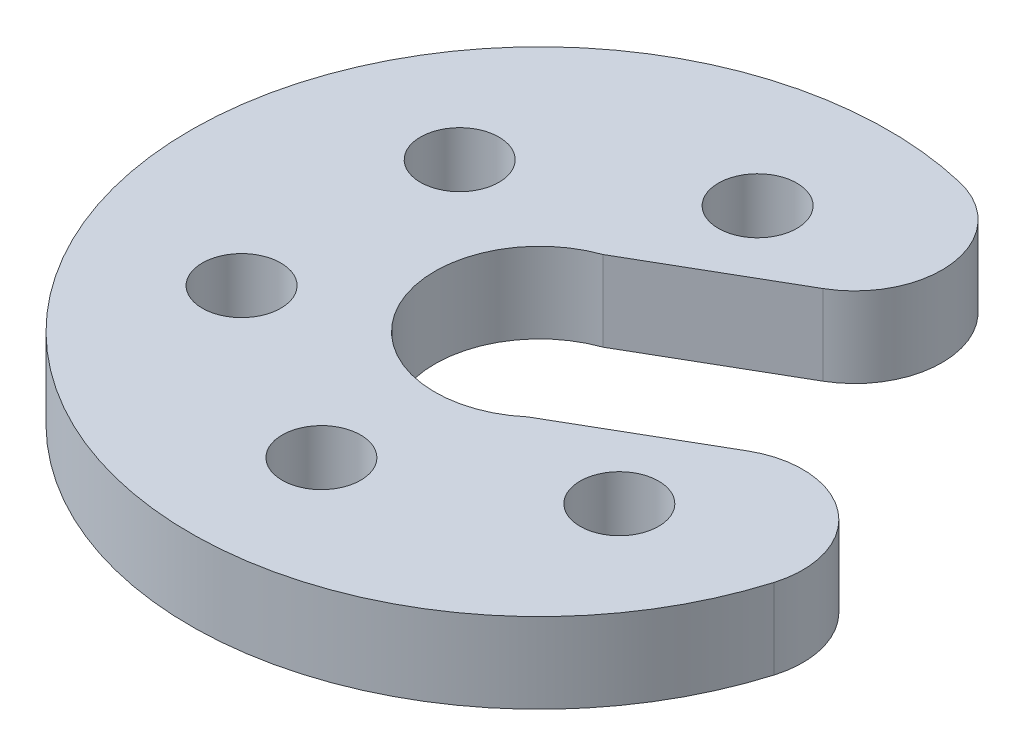
ISO-10303-21;
HEADER;
FILE_DESCRIPTION(('STEP AP214'),'2;1');
FILE_NAME('part.step','',(''),(''),'','','');
FILE_SCHEMA(('AUTOMOTIVE_DESIGN { 1 0 10303 214 1 1 1 1 }'));
ENDSEC;
DATA;
#1=APPLICATION_CONTEXT('core data for automotive mechanical design processes');
#2=APPLICATION_PROTOCOL_DEFINITION('international standard','automotive_design',2000,#1);
#3=PRODUCT_CONTEXT('',#1,'mechanical');
#4=PRODUCT('Part','Part','',(#3));
#5=PRODUCT_RELATED_PRODUCT_CATEGORY('part','',(#4));
#6=PRODUCT_DEFINITION_FORMATION('','',#4);
#7=PRODUCT_DEFINITION_CONTEXT('part definition',#1,'design');
#8=PRODUCT_DEFINITION('design','',#6,#7);
#9=PRODUCT_DEFINITION_SHAPE('','',#8);
#10=(LENGTH_UNIT() NAMED_UNIT(*) SI_UNIT(.MILLI.,.METRE.));
#11=(NAMED_UNIT(*) PLANE_ANGLE_UNIT() SI_UNIT($,.RADIAN.));
#12=(NAMED_UNIT(*) SI_UNIT($,.STERADIAN.) SOLID_ANGLE_UNIT());
#13=UNCERTAINTY_MEASURE_WITH_UNIT(LENGTH_MEASURE(1.E-05),#10,'distance_accuracy_value','');
#14=(GEOMETRIC_REPRESENTATION_CONTEXT(3) GLOBAL_UNCERTAINTY_ASSIGNED_CONTEXT((#13)) GLOBAL_UNIT_ASSIGNED_CONTEXT((#10,
#11,#12)) REPRESENTATION_CONTEXT('',''));
#15=CARTESIAN_POINT('',(0.,0.,0.));
#16=DIRECTION('',(0.,0.,1.));
#17=DIRECTION('',(1.,0.,0.));
#18=AXIS2_PLACEMENT_3D('',#15,#16,#17);
#19=CARTESIAN_POINT('',(0.,4.6,0.));
#20=DIRECTION('',(0.,1.,0.));
#21=DIRECTION('',(0.,0.,1.));
#22=AXIS2_PLACEMENT_3D('',#19,#20,#21);
#23=PLANE('',#22);
#24=CARTESIAN_POINT('',(-10.8253175473055,4.6,-6.24999999999999));
#25=DIRECTION('',(0.,1.,0.));
#26=DIRECTION('',(0.,0.,1.));
#27=AXIS2_PLACEMENT_3D('',#24,#25,#26);
#28=CIRCLE('',#27,2.25);
#29=CARTESIAN_POINT('',(-10.8253175473055,4.6,-3.99999999999999));
#30=VERTEX_POINT('',#29);
#31=EDGE_CURVE('E147',#30,#30,#28,.T.);
#32=ORIENTED_EDGE('',*,*,#31,.F.);
#33=EDGE_LOOP('',(#32));
#34=FACE_BOUND('',#33,.T.);
#35=CARTESIAN_POINT('',(0.,4.6,12.5));
#36=DIRECTION('',(0.,1.,0.));
#37=DIRECTION('',(0.,0.,1.));
#38=AXIS2_PLACEMENT_3D('',#35,#36,#37);
#39=CIRCLE('',#38,2.25);
#40=CARTESIAN_POINT('',(0.,4.6,14.75));
#41=VERTEX_POINT('',#40);
#42=EDGE_CURVE('E159',#41,#41,#39,.T.);
#43=ORIENTED_EDGE('',*,*,#42,.F.);
#44=EDGE_LOOP('',(#43));
#45=FACE_BOUND('',#44,.T.);
#46=CARTESIAN_POINT('',(0.,4.6,-12.5));
#47=DIRECTION('',(0.,1.,0.));
#48=DIRECTION('',(0.,0.,1.));
#49=AXIS2_PLACEMENT_3D('',#46,#47,#48);
#50=CIRCLE('',#49,2.25);
#51=CARTESIAN_POINT('',(0.,4.6,-10.25));
#52=VERTEX_POINT('',#51);
#53=EDGE_CURVE('E114',#52,#52,#50,.T.);
#54=ORIENTED_EDGE('',*,*,#53,.F.);
#55=EDGE_LOOP('',(#54));
#56=FACE_BOUND('',#55,.T.);
#57=CARTESIAN_POINT('',(10.8253175473055,4.6,6.25));
#58=DIRECTION('',(0.,1.,0.));
#59=DIRECTION('',(0.,0.,1.));
#60=AXIS2_PLACEMENT_3D('',#57,#58,#59);
#61=CIRCLE('',#60,2.25);
#62=CARTESIAN_POINT('',(10.8253175473055,4.6,8.5));
#63=VERTEX_POINT('',#62);
#64=EDGE_CURVE('E165',#63,#63,#61,.T.);
#65=ORIENTED_EDGE('',*,*,#64,.F.);
#66=EDGE_LOOP('',(#65));
#67=FACE_BOUND('',#66,.T.);
#68=CARTESIAN_POINT('',(-10.8253175473055,4.6,6.25000000000001));
#69=DIRECTION('',(0.,1.,0.));
#70=DIRECTION('',(0.,0.,1.));
#71=AXIS2_PLACEMENT_3D('',#68,#69,#70);
#72=CIRCLE('',#71,2.25);
#73=CARTESIAN_POINT('',(-10.8253175473055,4.6,8.50000000000001));
#74=VERTEX_POINT('',#73);
#75=EDGE_CURVE('E153',#74,#74,#72,.T.);
#76=ORIENTED_EDGE('',*,*,#75,.F.);
#77=EDGE_LOOP('',(#76));
#78=FACE_BOUND('',#77,.T.);
#79=CARTESIAN_POINT('',(0.,4.6,0.));
#80=DIRECTION('',(0.,1.,0.));
#81=DIRECTION('',(0.,0.,1.));
#82=AXIS2_PLACEMENT_3D('',#79,#80,#81);
#83=CIRCLE('',#82,20.);
#84=CARTESIAN_POINT('',(4.6323529007879,4.6,-19.4561380186964));
#85=VERTEX_POINT('',#84);
#86=CARTESIAN_POINT('',(19.1656862341212,4.6,5.71633371797131));
#87=VERTEX_POINT('',#86);
#88=EDGE_CURVE('E106',#85,#87,#83,.T.);
#89=ORIENTED_EDGE('',*,*,#88,.T.);
#90=CARTESIAN_POINT('',(14.3742646755909,4.6,4.28725028847848));
#91=DIRECTION('',(0.,1.,0.));
#92=DIRECTION('',(0.,0.,1.));
#93=AXIS2_PLACEMENT_3D('',#90,#91,#92);
#94=CIRCLE('',#93,5.);
#95=CARTESIAN_POINT('',(11.8742646755909,4.6,-0.0428767304437106));
#96=VERTEX_POINT('',#95);
#97=EDGE_CURVE('E41',#87,#96,#94,.T.);
#98=ORIENTED_EDGE('',*,*,#97,.T.);
#99=DIRECTION('',(-0.866025403784439,0.,0.5));
#100=VECTOR('',#99,1.);
#101=CARTESIAN_POINT('',(2.95,4.6,5.10954988232819));
#102=LINE('',#101,#100);
#103=CARTESIAN_POINT('',(3.89472218138457,4.59999999999999,4.56411427659639));
#104=VERTEX_POINT('',#103);
#105=EDGE_CURVE('E88',#96,#104,#102,.T.);
#106=ORIENTED_EDGE('',*,*,#105,.T.);
#107=CARTESIAN_POINT('',(0.,4.6,0.));
#108=DIRECTION('',(0.,1.,0.));
#109=DIRECTION('',(0.,0.,1.));
#110=AXIS2_PLACEMENT_3D('',#107,#108,#109);
#111=CIRCLE('',#110,6.);
#112=CARTESIAN_POINT('',(-2.00527781861544,4.6,-5.65498548805997));
#113=VERTEX_POINT('',#112);
#114=EDGE_CURVE('E91',#113,#104,#111,.T.);
#115=ORIENTED_EDGE('',*,*,#114,.F.);
#116=DIRECTION('',(0.866025403784439,0.,-0.5));
#117=VECTOR('',#116,1.);
#118=CARTESIAN_POINT('',(-2.95,4.6,-5.10954988232819));
#119=LINE('',#118,#117);
#120=CARTESIAN_POINT('',(5.97426467559093,4.6,-10.2619764951001));
#121=VERTEX_POINT('',#120);
#122=EDGE_CURVE('E133',#113,#121,#119,.T.);
#123=ORIENTED_EDGE('',*,*,#122,.T.);
#124=CARTESIAN_POINT('',(3.47426467559092,4.6,-14.5921035140223));
#125=DIRECTION('',(0.,1.,0.));
#126=DIRECTION('',(0.,0.,1.));
#127=AXIS2_PLACEMENT_3D('',#124,#125,#126);
#128=CIRCLE('',#127,5.);
#129=EDGE_CURVE('E131',#121,#85,#128,.T.);
#130=ORIENTED_EDGE('',*,*,#129,.T.);
#131=EDGE_LOOP('',(#89,#98,#106,#115,#123,#130));
#132=FACE_BOUND('',#131,.T.);
#133=ADVANCED_FACE('F33',(#34,#45,#56,#67,#78,#132),#23,.T.);
#134=CARTESIAN_POINT('',(0.,0.,0.));
#135=DIRECTION('',(0.,1.,0.));
#136=DIRECTION('',(0.,0.,1.));
#137=AXIS2_PLACEMENT_3D('',#134,#135,#136);
#138=PLANE('',#137);
#139=CARTESIAN_POINT('',(-10.8253175473055,0.,-6.24999999999999));
#140=DIRECTION('',(0.,1.,0.));
#141=DIRECTION('',(0.,0.,1.));
#142=AXIS2_PLACEMENT_3D('',#139,#140,#141);
#143=CIRCLE('',#142,2.25);
#144=CARTESIAN_POINT('',(-10.8253175473055,0.,-3.99999999999999));
#145=VERTEX_POINT('',#144);
#146=EDGE_CURVE('E143',#145,#145,#143,.T.);
#147=ORIENTED_EDGE('',*,*,#146,.T.);
#148=EDGE_LOOP('',(#147));
#149=FACE_BOUND('',#148,.T.);
#150=CARTESIAN_POINT('',(0.,0.,12.5));
#151=DIRECTION('',(0.,1.,0.));
#152=DIRECTION('',(0.,0.,1.));
#153=AXIS2_PLACEMENT_3D('',#150,#151,#152);
#154=CIRCLE('',#153,2.25);
#155=CARTESIAN_POINT('',(0.,0.,14.75));
#156=VERTEX_POINT('',#155);
#157=EDGE_CURVE('E156',#156,#156,#154,.T.);
#158=ORIENTED_EDGE('',*,*,#157,.T.);
#159=EDGE_LOOP('',(#158));
#160=FACE_BOUND('',#159,.T.);
#161=CARTESIAN_POINT('',(0.,0.,-12.5));
#162=DIRECTION('',(0.,1.,0.));
#163=DIRECTION('',(0.,0.,1.));
#164=AXIS2_PLACEMENT_3D('',#161,#162,#163);
#165=CIRCLE('',#164,2.25);
#166=CARTESIAN_POINT('',(0.,0.,-10.25));
#167=VERTEX_POINT('',#166);
#168=EDGE_CURVE('E117',#167,#167,#165,.T.);
#169=ORIENTED_EDGE('',*,*,#168,.T.);
#170=EDGE_LOOP('',(#169));
#171=FACE_BOUND('',#170,.T.);
#172=CARTESIAN_POINT('',(10.8253175473055,0.,6.25));
#173=DIRECTION('',(0.,1.,0.));
#174=DIRECTION('',(0.,0.,1.));
#175=AXIS2_PLACEMENT_3D('',#172,#173,#174);
#176=CIRCLE('',#175,2.25);
#177=CARTESIAN_POINT('',(10.8253175473055,0.,8.5));
#178=VERTEX_POINT('',#177);
#179=EDGE_CURVE('E162',#178,#178,#176,.T.);
#180=ORIENTED_EDGE('',*,*,#179,.T.);
#181=EDGE_LOOP('',(#180));
#182=FACE_BOUND('',#181,.T.);
#183=CARTESIAN_POINT('',(-10.8253175473055,0.,6.25000000000001));
#184=DIRECTION('',(0.,1.,0.));
#185=DIRECTION('',(0.,0.,1.));
#186=AXIS2_PLACEMENT_3D('',#183,#184,#185);
#187=CIRCLE('',#186,2.25);
#188=CARTESIAN_POINT('',(-10.8253175473055,0.,8.50000000000001));
#189=VERTEX_POINT('',#188);
#190=EDGE_CURVE('E150',#189,#189,#187,.T.);
#191=ORIENTED_EDGE('',*,*,#190,.T.);
#192=EDGE_LOOP('',(#191));
#193=FACE_BOUND('',#192,.T.);
#194=DIRECTION('',(-0.866025403784439,0.,0.5));
#195=VECTOR('',#194,1.);
#196=CARTESIAN_POINT('',(2.95,0.,5.10954988232819));
#197=LINE('',#196,#195);
#198=CARTESIAN_POINT('',(11.8742646755909,0.,-0.0428767304437106));
#199=VERTEX_POINT('',#198);
#200=CARTESIAN_POINT('',(3.89472218138458,0.,4.56411427659639));
#201=VERTEX_POINT('',#200);
#202=EDGE_CURVE('E97',#199,#201,#197,.T.);
#203=ORIENTED_EDGE('',*,*,#202,.F.);
#204=CARTESIAN_POINT('',(14.3742646755909,0.,4.28725028847848));
#205=DIRECTION('',(0.,1.,0.));
#206=DIRECTION('',(0.,0.,1.));
#207=AXIS2_PLACEMENT_3D('',#204,#205,#206);
#208=CIRCLE('',#207,5.);
#209=CARTESIAN_POINT('',(19.1656862341212,0.,5.71633371797131));
#210=VERTEX_POINT('',#209);
#211=EDGE_CURVE('E125',#199,#210,#208,.F.);
#212=ORIENTED_EDGE('',*,*,#211,.T.);
#213=CARTESIAN_POINT('',(0.,0.,0.));
#214=DIRECTION('',(0.,1.,0.));
#215=DIRECTION('',(0.,0.,1.));
#216=AXIS2_PLACEMENT_3D('',#213,#214,#215);
#217=CIRCLE('',#216,20.);
#218=CARTESIAN_POINT('',(4.6323529007879,0.,-19.4561380186964));
#219=VERTEX_POINT('',#218);
#220=EDGE_CURVE('E110',#219,#210,#217,.T.);
#221=ORIENTED_EDGE('',*,*,#220,.F.);
#222=CARTESIAN_POINT('',(3.47426467559092,0.,-14.5921035140223));
#223=DIRECTION('',(0.,1.,0.));
#224=DIRECTION('',(0.,0.,1.));
#225=AXIS2_PLACEMENT_3D('',#222,#223,#224);
#226=CIRCLE('',#225,5.);
#227=CARTESIAN_POINT('',(5.97426467559093,0.,-10.2619764951001));
#228=VERTEX_POINT('',#227);
#229=EDGE_CURVE('E123',#219,#228,#226,.F.);
#230=ORIENTED_EDGE('',*,*,#229,.T.);
#231=DIRECTION('',(0.866025403784439,0.,-0.5));
#232=VECTOR('',#231,1.);
#233=CARTESIAN_POINT('',(-2.95,0.,-5.10954988232819));
#234=LINE('',#233,#232);
#235=CARTESIAN_POINT('',(-2.00527781861544,0.,-5.65498548805997));
#236=VERTEX_POINT('',#235);
#237=EDGE_CURVE('E96',#236,#228,#234,.T.);
#238=ORIENTED_EDGE('',*,*,#237,.F.);
#239=CARTESIAN_POINT('',(0.,0.,0.));
#240=DIRECTION('',(0.,1.,0.));
#241=DIRECTION('',(0.,0.,1.));
#242=AXIS2_PLACEMENT_3D('',#239,#240,#241);
#243=CIRCLE('',#242,6.);
#244=EDGE_CURVE('E111',#236,#201,#243,.T.);
#245=ORIENTED_EDGE('',*,*,#244,.T.);
#246=EDGE_LOOP('',(#203,#212,#221,#230,#238,#245));
#247=FACE_BOUND('',#246,.T.);
#248=ADVANCED_FACE('F140',(#149,#160,#171,#182,#193,#247),#138,.F.);
#249=CARTESIAN_POINT('',(0.,4.6,0.));
#250=DIRECTION('',(0.,-1.,0.));
#251=DIRECTION('',(0.,0.,-1.));
#252=AXIS2_PLACEMENT_3D('',#249,#250,#251);
#253=CYLINDRICAL_SURFACE('',#252,20.);
#254=ORIENTED_EDGE('',*,*,#220,.T.);
#255=DIRECTION('',(0.,-1.,0.));
#256=VECTOR('',#255,1.);
#257=CARTESIAN_POINT('',(19.1656862341212,4.6,5.71633371797131));
#258=LINE('',#257,#256);
#259=EDGE_CURVE('E54',#210,#87,#258,.F.);
#260=ORIENTED_EDGE('',*,*,#259,.T.);
#261=ORIENTED_EDGE('',*,*,#88,.F.);
#262=DIRECTION('',(0.,-1.,0.));
#263=VECTOR('',#262,1.);
#264=CARTESIAN_POINT('',(4.6323529007879,4.6,-19.4561380186964));
#265=LINE('',#264,#263);
#266=EDGE_CURVE('E127',#85,#219,#265,.T.);
#267=ORIENTED_EDGE('',*,*,#266,.T.);
#268=EDGE_LOOP('',(#254,#260,#261,#267));
#269=FACE_BOUND('',#268,.T.);
#270=ADVANCED_FACE('F136',(#269),#253,.T.);
#271=CARTESIAN_POINT('',(0.,4.6,0.));
#272=DIRECTION('',(0.,-1.,0.));
#273=DIRECTION('',(0.,0.,-1.));
#274=AXIS2_PLACEMENT_3D('',#271,#272,#273);
#275=CYLINDRICAL_SURFACE('',#274,6.);
#276=DIRECTION('',(0.,-1.,0.));
#277=VECTOR('',#276,1.);
#278=CARTESIAN_POINT('',(-2.00527781861544,75.5440800912945,-5.65498548805997));
#279=LINE('',#278,#277);
#280=EDGE_CURVE('E105',#113,#236,#279,.T.);
#281=ORIENTED_EDGE('',*,*,#280,.F.);
#282=ORIENTED_EDGE('',*,*,#114,.T.);
#283=DIRECTION('',(0.,-1.,0.));
#284=VECTOR('',#283,1.);
#285=CARTESIAN_POINT('',(3.89472218138458,4.6,4.56411427659639));
#286=LINE('',#285,#284);
#287=EDGE_CURVE('E100',#104,#201,#286,.T.);
#288=ORIENTED_EDGE('',*,*,#287,.T.);
#289=ORIENTED_EDGE('',*,*,#244,.F.);
#290=EDGE_LOOP('',(#281,#282,#288,#289));
#291=FACE_BOUND('',#290,.T.);
#292=ADVANCED_FACE('F108',(#291),#275,.F.);
#293=CARTESIAN_POINT('',(0.,4.6,-12.5));
#294=DIRECTION('',(0.,-1.,0.));
#295=DIRECTION('',(0.,0.,-1.));
#296=AXIS2_PLACEMENT_3D('',#293,#294,#295);
#297=CYLINDRICAL_SURFACE('',#296,2.25);
#298=ORIENTED_EDGE('',*,*,#53,.T.);
#299=EDGE_LOOP('',(#298));
#300=FACE_BOUND('',#299,.T.);
#301=ORIENTED_EDGE('',*,*,#168,.F.);
#302=EDGE_LOOP('',(#301));
#303=FACE_BOUND('',#302,.T.);
#304=ADVANCED_FACE('F177',(#300,#303),#297,.F.);
#305=CARTESIAN_POINT('',(10.8253175473055,4.6,6.25));
#306=DIRECTION('',(0.,-1.,0.));
#307=DIRECTION('',(0.,0.,-1.));
#308=AXIS2_PLACEMENT_3D('',#305,#306,#307);
#309=CYLINDRICAL_SURFACE('',#308,2.25);
#310=ORIENTED_EDGE('',*,*,#64,.T.);
#311=EDGE_LOOP('',(#310));
#312=FACE_BOUND('',#311,.T.);
#313=ORIENTED_EDGE('',*,*,#179,.F.);
#314=EDGE_LOOP('',(#313));
#315=FACE_BOUND('',#314,.T.);
#316=ADVANCED_FACE('F179',(#312,#315),#309,.F.);
#317=CARTESIAN_POINT('',(0.,4.6,12.5));
#318=DIRECTION('',(0.,-1.,0.));
#319=DIRECTION('',(0.,0.,-1.));
#320=AXIS2_PLACEMENT_3D('',#317,#318,#319);
#321=CYLINDRICAL_SURFACE('',#320,2.25);
#322=ORIENTED_EDGE('',*,*,#42,.T.);
#323=EDGE_LOOP('',(#322));
#324=FACE_BOUND('',#323,.T.);
#325=ORIENTED_EDGE('',*,*,#157,.F.);
#326=EDGE_LOOP('',(#325));
#327=FACE_BOUND('',#326,.T.);
#328=ADVANCED_FACE('F185',(#324,#327),#321,.F.);
#329=CARTESIAN_POINT('',(-10.8253175473055,4.6,6.25000000000001));
#330=DIRECTION('',(0.,-1.,0.));
#331=DIRECTION('',(0.,0.,-1.));
#332=AXIS2_PLACEMENT_3D('',#329,#330,#331);
#333=CYLINDRICAL_SURFACE('',#332,2.25);
#334=ORIENTED_EDGE('',*,*,#75,.T.);
#335=EDGE_LOOP('',(#334));
#336=FACE_BOUND('',#335,.T.);
#337=ORIENTED_EDGE('',*,*,#190,.F.);
#338=EDGE_LOOP('',(#337));
#339=FACE_BOUND('',#338,.T.);
#340=ADVANCED_FACE('F218',(#336,#339),#333,.F.);
#341=CARTESIAN_POINT('',(-10.8253175473055,4.6,-6.24999999999999));
#342=DIRECTION('',(0.,-1.,0.));
#343=DIRECTION('',(0.,0.,-1.));
#344=AXIS2_PLACEMENT_3D('',#341,#342,#343);
#345=CYLINDRICAL_SURFACE('',#344,2.25);
#346=ORIENTED_EDGE('',*,*,#31,.T.);
#347=EDGE_LOOP('',(#346));
#348=FACE_BOUND('',#347,.T.);
#349=ORIENTED_EDGE('',*,*,#146,.F.);
#350=EDGE_LOOP('',(#349));
#351=FACE_BOUND('',#350,.T.);
#352=ADVANCED_FACE('F213',(#348,#351),#345,.F.);
#353=CARTESIAN_POINT('',(3.89472218138457,75.5440800912945,4.56411427659639));
#354=DIRECTION('',(-0.5,0.,-0.866025403784438));
#355=DIRECTION('',(-0.866025403784439,0.,0.5));
#356=AXIS2_PLACEMENT_3D('',#353,#354,#355);
#357=PLANE('',#356);
#358=ORIENTED_EDGE('',*,*,#105,.F.);
#359=DIRECTION('',(0.,1.,0.));
#360=VECTOR('',#359,1.);
#361=CARTESIAN_POINT('',(11.8742646755909,0.,-0.0428767304437079));
#362=LINE('',#361,#360);
#363=EDGE_CURVE('E121',#96,#199,#362,.F.);
#364=ORIENTED_EDGE('',*,*,#363,.T.);
#365=ORIENTED_EDGE('',*,*,#202,.T.);
#366=ORIENTED_EDGE('',*,*,#287,.F.);
#367=EDGE_LOOP('',(#358,#364,#365,#366));
#368=FACE_BOUND('',#367,.T.);
#369=ADVANCED_FACE('F101',(#368),#357,.T.);
#370=CARTESIAN_POINT('',(-2.00527781861544,75.5440800912945,-5.65498548805997));
#371=DIRECTION('',(0.5,0.,0.866025403784438));
#372=DIRECTION('',(0.866025403784439,0.,-0.5));
#373=AXIS2_PLACEMENT_3D('',#370,#371,#372);
#374=PLANE('',#373);
#375=ORIENTED_EDGE('',*,*,#237,.T.);
#376=DIRECTION('',(0.,1.,0.));
#377=VECTOR('',#376,1.);
#378=CARTESIAN_POINT('',(5.97426467559093,4.6,-10.2619764951001));
#379=LINE('',#378,#377);
#380=EDGE_CURVE('E11',#228,#121,#379,.T.);
#381=ORIENTED_EDGE('',*,*,#380,.T.);
#382=ORIENTED_EDGE('',*,*,#122,.F.);
#383=ORIENTED_EDGE('',*,*,#280,.T.);
#384=EDGE_LOOP('',(#375,#381,#382,#383));
#385=FACE_BOUND('',#384,.T.);
#386=ADVANCED_FACE('F141',(#385),#374,.T.);
#387=CARTESIAN_POINT('',(14.3742646755909,4.6,4.28725028847848));
#388=DIRECTION('',(0.,-1.,0.));
#389=DIRECTION('',(0.,0.,-1.));
#390=AXIS2_PLACEMENT_3D('',#387,#388,#389);
#391=CYLINDRICAL_SURFACE('',#390,5.);
#392=ORIENTED_EDGE('',*,*,#97,.F.);
#393=ORIENTED_EDGE('',*,*,#259,.F.);
#394=ORIENTED_EDGE('',*,*,#211,.F.);
#395=ORIENTED_EDGE('',*,*,#363,.F.);
#396=EDGE_LOOP('',(#392,#393,#394,#395));
#397=FACE_BOUND('',#396,.T.);
#398=ADVANCED_FACE('F201',(#397),#391,.T.);
#399=CARTESIAN_POINT('',(3.47426467559092,4.6,-14.5921035140223));
#400=DIRECTION('',(0.,-1.,0.));
#401=DIRECTION('',(0.,0.,-1.));
#402=AXIS2_PLACEMENT_3D('',#399,#400,#401);
#403=CYLINDRICAL_SURFACE('',#402,5.);
#404=ORIENTED_EDGE('',*,*,#129,.F.);
#405=ORIENTED_EDGE('',*,*,#380,.F.);
#406=ORIENTED_EDGE('',*,*,#229,.F.);
#407=ORIENTED_EDGE('',*,*,#266,.F.);
#408=EDGE_LOOP('',(#404,#405,#406,#407));
#409=FACE_BOUND('',#408,.T.);
#410=ADVANCED_FACE('F35',(#409),#403,.T.);
#411=CLOSED_SHELL('',(#133,#248,#270,#292,#304,#316,#328,#340,#352,#369,#386,#398,#410));
#412=MANIFOLD_SOLID_BREP('B2',#411);
#413=ADVANCED_BREP_SHAPE_REPRESENTATION('',(#18,#412),#14);
#414=SHAPE_DEFINITION_REPRESENTATION(#9,#413);
ENDSEC;
END-ISO-10303-21;
